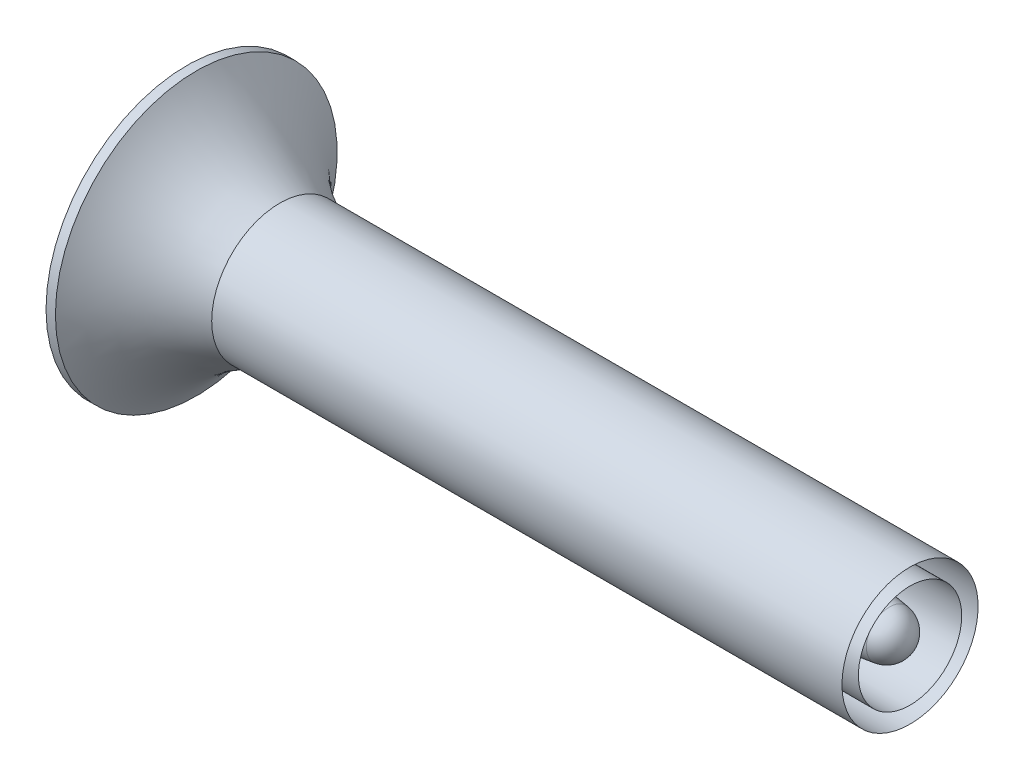
ISO-10303-21;
HEADER;
FILE_DESCRIPTION(('STEP AP214'),'2;1');
FILE_NAME('part.step','',(''),(''),'','','');
FILE_SCHEMA(('AUTOMOTIVE_DESIGN { 1 0 10303 214 1 1 1 1 }'));
ENDSEC;
DATA;
#1=APPLICATION_CONTEXT('core data for automotive mechanical design processes');
#2=APPLICATION_PROTOCOL_DEFINITION('international standard','automotive_design',2000,#1);
#3=PRODUCT_CONTEXT('',#1,'mechanical');
#4=PRODUCT('Part','Part','',(#3));
#5=PRODUCT_RELATED_PRODUCT_CATEGORY('part','',(#4));
#6=PRODUCT_DEFINITION_FORMATION('','',#4);
#7=PRODUCT_DEFINITION_CONTEXT('part definition',#1,'design');
#8=PRODUCT_DEFINITION('design','',#6,#7);
#9=PRODUCT_DEFINITION_SHAPE('','',#8);
#10=(LENGTH_UNIT() NAMED_UNIT(*) SI_UNIT(.MILLI.,.METRE.));
#11=(NAMED_UNIT(*) PLANE_ANGLE_UNIT() SI_UNIT($,.RADIAN.));
#12=(NAMED_UNIT(*) SI_UNIT($,.STERADIAN.) SOLID_ANGLE_UNIT());
#13=UNCERTAINTY_MEASURE_WITH_UNIT(LENGTH_MEASURE(1.E-05),#10,'distance_accuracy_value','');
#14=(GEOMETRIC_REPRESENTATION_CONTEXT(3) GLOBAL_UNCERTAINTY_ASSIGNED_CONTEXT((#13)) GLOBAL_UNIT_ASSIGNED_CONTEXT((#10,
#11,#12)) REPRESENTATION_CONTEXT('',''));
#15=CARTESIAN_POINT('',(0.,0.,0.));
#16=DIRECTION('',(0.,0.,1.));
#17=DIRECTION('',(1.,0.,0.));
#18=AXIS2_PLACEMENT_3D('',#15,#16,#17);
#19=CARTESIAN_POINT('',(0.,0.,0.));
#20=DIRECTION('',(1.,0.,0.));
#21=DIRECTION('',(0.,0.,-1.));
#22=AXIS2_PLACEMENT_3D('',#19,#20,#21);
#23=CYLINDRICAL_SURFACE('',#22,1.8415);
#24=CARTESIAN_POINT('',(0.,0.,0.));
#25=DIRECTION('',(-1.,0.,0.));
#26=DIRECTION('',(0.,0.,1.));
#27=AXIS2_PLACEMENT_3D('',#24,#25,#26);
#28=CIRCLE('',#27,1.8415);
#29=CARTESIAN_POINT('',(0.,0.,1.8415));
#30=VERTEX_POINT('',#29);
#31=EDGE_CURVE('E60',#30,#30,#28,.T.);
#32=ORIENTED_EDGE('',*,*,#31,.T.);
#33=EDGE_LOOP('',(#32));
#34=FACE_BOUND('',#33,.T.);
#35=CARTESIAN_POINT('',(19.558,0.,0.));
#36=DIRECTION('',(-1.,0.,0.));
#37=DIRECTION('',(0.,0.,1.));
#38=AXIS2_PLACEMENT_3D('',#35,#36,#37);
#39=CIRCLE('',#38,1.8415);
#40=CARTESIAN_POINT('',(19.558,0.,1.8415));
#41=VERTEX_POINT('',#40);
#42=EDGE_CURVE('E11',#41,#41,#39,.T.);
#43=ORIENTED_EDGE('',*,*,#42,.F.);
#44=EDGE_LOOP('',(#43));
#45=FACE_BOUND('',#44,.T.);
#46=ADVANCED_FACE('F56',(#34,#45),#23,.F.);
#47=OPEN_SHELL('',(#46));
#48=SHELL_BASED_SURFACE_MODEL('B2',(#47));
#49=CARTESIAN_POINT('',(0.,0.,0.));
#50=DIRECTION('',(1.,0.,0.));
#51=DIRECTION('',(0.,0.,-1.));
#52=AXIS2_PLACEMENT_3D('',#49,#50,#51);
#53=CYLINDRICAL_SURFACE('',#52,1.397);
#54=CARTESIAN_POINT('',(0.,0.,0.));
#55=DIRECTION('',(1.,0.,0.));
#56=DIRECTION('',(0.,0.,-1.));
#57=AXIS2_PLACEMENT_3D('',#54,#55,#56);
#58=CIRCLE('',#57,1.397);
#59=CARTESIAN_POINT('',(0.,0.,-1.397));
#60=VERTEX_POINT('',#59);
#61=EDGE_CURVE('E94',#60,#60,#58,.T.);
#62=ORIENTED_EDGE('',*,*,#61,.T.);
#63=EDGE_LOOP('',(#62));
#64=FACE_BOUND('',#63,.T.);
#65=CARTESIAN_POINT('',(19.558,0.,0.));
#66=DIRECTION('',(1.,0.,0.));
#67=DIRECTION('',(0.,0.,-1.));
#68=AXIS2_PLACEMENT_3D('',#65,#66,#67);
#69=CIRCLE('',#68,1.397);
#70=CARTESIAN_POINT('',(19.558,0.,-1.397));
#71=VERTEX_POINT('',#70);
#72=EDGE_CURVE('E55',#71,#71,#69,.T.);
#73=ORIENTED_EDGE('',*,*,#72,.F.);
#74=EDGE_LOOP('',(#73));
#75=FACE_BOUND('',#74,.T.);
#76=ADVANCED_FACE('F90',(#64,#75),#53,.T.);
#77=OPEN_SHELL('',(#76));
#78=SHELL_BASED_SURFACE_MODEL('B6',(#77));
#79=CARTESIAN_POINT('',(0.,0.,0.));
#80=DIRECTION('',(-1.,0.,0.));
#81=DIRECTION('',(0.,0.,1.));
#82=AXIS2_PLACEMENT_3D('',#79,#80,#81);
#83=CYLINDRICAL_SURFACE('',#82,3.81);
#84=CARTESIAN_POINT('',(0.254000000000001,0.,0.));
#85=DIRECTION('',(-1.,0.,0.));
#86=DIRECTION('',(0.,0.,1.));
#87=AXIS2_PLACEMENT_3D('',#84,#85,#86);
#88=CIRCLE('',#87,3.81);
#89=CARTESIAN_POINT('',(0.254000000000001,0.,3.81));
#90=VERTEX_POINT('',#89);
#91=EDGE_CURVE('E136',#90,#90,#88,.T.);
#92=ORIENTED_EDGE('',*,*,#91,.T.);
#93=EDGE_LOOP('',(#92));
#94=FACE_BOUND('',#93,.T.);
#95=CARTESIAN_POINT('',(0.,0.,0.));
#96=DIRECTION('',(-1.,0.,0.));
#97=DIRECTION('',(0.,0.,1.));
#98=AXIS2_PLACEMENT_3D('',#95,#96,#97);
#99=CIRCLE('',#98,3.81);
#100=CARTESIAN_POINT('',(0.,0.,3.81));
#101=VERTEX_POINT('',#100);
#102=EDGE_CURVE('E89',#101,#101,#99,.T.);
#103=ORIENTED_EDGE('',*,*,#102,.F.);
#104=EDGE_LOOP('',(#103));
#105=FACE_BOUND('',#104,.T.);
#106=ADVANCED_FACE('F117',(#94,#105),#83,.T.);
#107=CARTESIAN_POINT('',(0.,-3.81,0.));
#108=DIRECTION('',(-1.,0.,0.));
#109=DIRECTION('',(0.,0.,1.));
#110=AXIS2_PLACEMENT_3D('',#107,#108,#109);
#111=PLANE('',#110);
#112=ORIENTED_EDGE('',*,*,#102,.T.);
#113=EDGE_LOOP('',(#112));
#114=FACE_BOUND('',#113,.T.);
#115=ADVANCED_FACE('F154',(#114),#111,.T.);
#116=CARTESIAN_POINT('',(18.923,0.,0.));
#117=DIRECTION('',(-1.,0.,0.));
#118=DIRECTION('',(0.,-1.,0.));
#119=AXIS2_PLACEMENT_3D('',#116,#117,#118);
#120=SPHERICAL_SURFACE('',#119,0.635);
#121=CARTESIAN_POINT('',(19.0058841320597,0.,0.));
#122=DIRECTION('',(-1.,0.,0.));
#123=DIRECTION('',(0.,0.,1.));
#124=AXIS2_PLACEMENT_3D('',#121,#122,#123);
#125=CIRCLE('',#124,0.62956748697237);
#126=CARTESIAN_POINT('',(19.0058841320597,0.,0.62956748697237));
#127=VERTEX_POINT('',#126);
#128=EDGE_CURVE('E123',#127,#127,#125,.T.);
#129=ORIENTED_EDGE('',*,*,#128,.F.);
#130=EDGE_LOOP('',(#129));
#131=FACE_BOUND('',#130,.T.);
#132=ADVANCED_FACE('F158',(#131),#120,.T.);
#133=CARTESIAN_POINT('',(13.176655464991,0.,0.));
#134=DIRECTION('',(-1.,0.,0.));
#135=DIRECTION('',(0.,0.,1.));
#136=AXIS2_PLACEMENT_3D('',#133,#134,#135);
#137=CONICAL_SURFACE('',#136,1.397,0.130899693899571);
#138=ORIENTED_EDGE('',*,*,#128,.T.);
#139=EDGE_LOOP('',(#138));
#140=FACE_BOUND('',#139,.T.);
#141=CARTESIAN_POINT('',(13.176655464991,0.,0.));
#142=DIRECTION('',(-1.,0.,0.));
#143=DIRECTION('',(0.,0.,1.));
#144=AXIS2_PLACEMENT_3D('',#141,#142,#143);
#145=CIRCLE('',#144,1.397);
#146=CARTESIAN_POINT('',(13.176655464991,0.,1.397));
#147=VERTEX_POINT('',#146);
#148=EDGE_CURVE('E127',#147,#147,#145,.T.);
#149=ORIENTED_EDGE('',*,*,#148,.F.);
#150=EDGE_LOOP('',(#149));
#151=FACE_BOUND('',#150,.T.);
#152=ADVANCED_FACE('F150',(#140,#151),#137,.T.);
#153=CARTESIAN_POINT('',(0.,0.,0.));
#154=DIRECTION('',(-1.,0.,0.));
#155=DIRECTION('',(0.,0.,1.));
#156=AXIS2_PLACEMENT_3D('',#153,#154,#155);
#157=CYLINDRICAL_SURFACE('',#156,1.397);
#158=ORIENTED_EDGE('',*,*,#148,.T.);
#159=EDGE_LOOP('',(#158));
#160=FACE_BOUND('',#159,.T.);
#161=CARTESIAN_POINT('',(4.572,0.,0.));
#162=DIRECTION('',(-1.,0.,0.));
#163=DIRECTION('',(0.,0.,1.));
#164=AXIS2_PLACEMENT_3D('',#161,#162,#163);
#165=CIRCLE('',#164,1.397);
#166=CARTESIAN_POINT('',(4.572,0.,1.397));
#167=VERTEX_POINT('',#166);
#168=EDGE_CURVE('E131',#167,#167,#165,.T.);
#169=ORIENTED_EDGE('',*,*,#168,.F.);
#170=EDGE_LOOP('',(#169));
#171=FACE_BOUND('',#170,.T.);
#172=ADVANCED_FACE('F144',(#160,#171),#157,.T.);
#173=CARTESIAN_POINT('',(4.572,0.,0.));
#174=DIRECTION('',(-1.,0.,0.));
#175=DIRECTION('',(0.,0.,1.));
#176=AXIS2_PLACEMENT_3D('',#173,#174,#175);
#177=TOROIDAL_SURFACE('',#176,6.46697368421053,5.06997368421053);
#178=ORIENTED_EDGE('',*,*,#168,.T.);
#179=EDGE_LOOP('',(#178));
#180=FACE_BOUND('',#179,.T.);
#181=ORIENTED_EDGE('',*,*,#91,.F.);
#182=EDGE_LOOP('',(#181));
#183=FACE_BOUND('',#182,.T.);
#184=ADVANCED_FACE('F142',(#180,#183),#177,.F.);
#185=CLOSED_SHELL('',(#106,#115,#132,#152,#172,#184));
#186=MANIFOLD_SOLID_BREP('B50',#185);
#187=ADVANCED_BREP_SHAPE_REPRESENTATION('',(#18,#186),#14);
#188=MANIFOLD_SURFACE_SHAPE_REPRESENTATION('',(#18,#48,#78),#14);
#189=SHAPE_REPRESENTATION('',(#18),#14);
#190=SHAPE_DEFINITION_REPRESENTATION(#9,#189);
#191=SHAPE_REPRESENTATION_RELATIONSHIP('','',#189,#187);
#192=SHAPE_REPRESENTATION_RELATIONSHIP('','',#189,#188);
ENDSEC;
END-ISO-10303-21;
